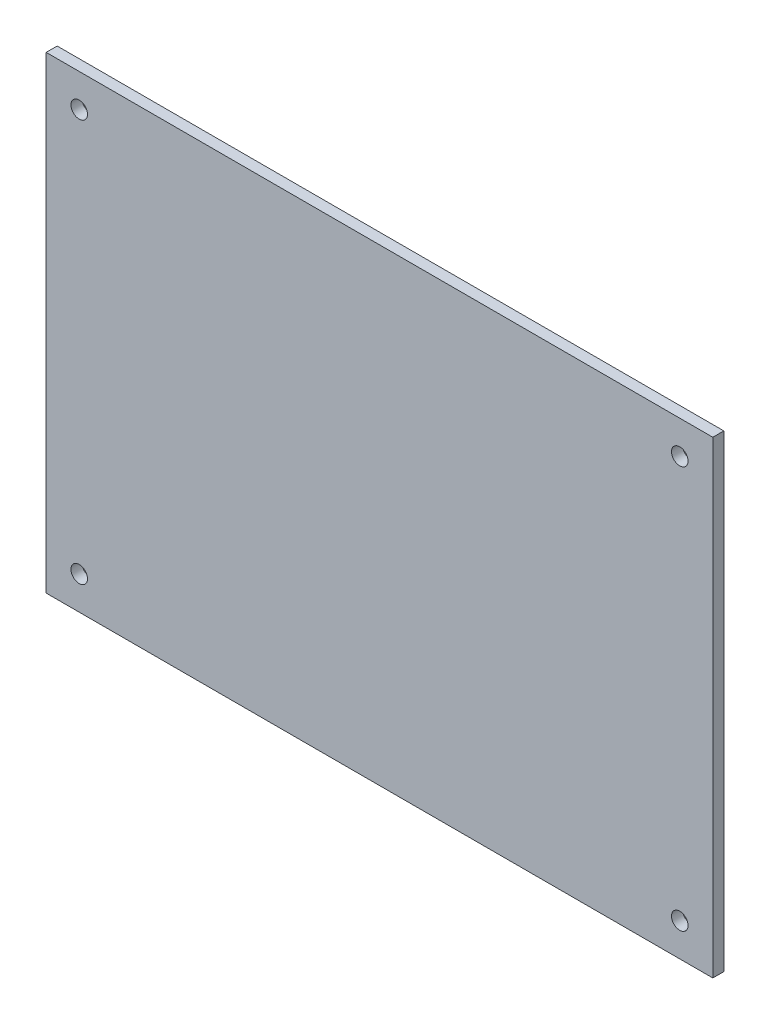
ISO-10303-21;
HEADER;
FILE_DESCRIPTION(('STEP AP214'),'2;1');
FILE_NAME('part.step','',(''),(''),'','','');
FILE_SCHEMA(('AUTOMOTIVE_DESIGN { 1 0 10303 214 1 1 1 1 }'));
ENDSEC;
DATA;
#1=APPLICATION_CONTEXT('core data for automotive mechanical design processes');
#2=APPLICATION_PROTOCOL_DEFINITION('international standard','automotive_design',2000,#1);
#3=PRODUCT_CONTEXT('',#1,'mechanical');
#4=PRODUCT('Part','Part','',(#3));
#5=PRODUCT_RELATED_PRODUCT_CATEGORY('part','',(#4));
#6=PRODUCT_DEFINITION_FORMATION('','',#4);
#7=PRODUCT_DEFINITION_CONTEXT('part definition',#1,'design');
#8=PRODUCT_DEFINITION('design','',#6,#7);
#9=PRODUCT_DEFINITION_SHAPE('','',#8);
#10=(LENGTH_UNIT() NAMED_UNIT(*) SI_UNIT(.MILLI.,.METRE.));
#11=(NAMED_UNIT(*) PLANE_ANGLE_UNIT() SI_UNIT($,.RADIAN.));
#12=(NAMED_UNIT(*) SI_UNIT($,.STERADIAN.) SOLID_ANGLE_UNIT());
#13=UNCERTAINTY_MEASURE_WITH_UNIT(LENGTH_MEASURE(1.E-05),#10,'distance_accuracy_value','');
#14=(GEOMETRIC_REPRESENTATION_CONTEXT(3) GLOBAL_UNCERTAINTY_ASSIGNED_CONTEXT((#13)) GLOBAL_UNIT_ASSIGNED_CONTEXT((#10,
#11,#12)) REPRESENTATION_CONTEXT('',''));
#15=CARTESIAN_POINT('',(0.,0.,0.));
#16=DIRECTION('',(0.,0.,1.));
#17=DIRECTION('',(1.,0.,0.));
#18=AXIS2_PLACEMENT_3D('',#15,#16,#17);
#19=CARTESIAN_POINT('',(0.,0.,2.));
#20=DIRECTION('',(1.,0.,0.));
#21=DIRECTION('',(0.,0.,-1.));
#22=AXIS2_PLACEMENT_3D('',#19,#20,#21);
#23=PLANE('',#22);
#24=DIRECTION('',(0.,-1.,0.));
#25=VECTOR('',#24,1.);
#26=CARTESIAN_POINT('',(0.,0.,0.));
#27=LINE('',#26,#25);
#28=CARTESIAN_POINT('',(0.,85.,0.));
#29=VERTEX_POINT('',#28);
#30=CARTESIAN_POINT('',(0.,0.,0.));
#31=VERTEX_POINT('',#30);
#32=EDGE_CURVE('E100',#29,#31,#27,.T.);
#33=ORIENTED_EDGE('',*,*,#32,.T.);
#34=DIRECTION('',(0.,0.,-1.));
#35=VECTOR('',#34,1.);
#36=CARTESIAN_POINT('',(0.,0.,2.));
#37=LINE('',#36,#35);
#38=CARTESIAN_POINT('',(0.,0.,2.));
#39=VERTEX_POINT('',#38);
#40=EDGE_CURVE('E11',#39,#31,#37,.T.);
#41=ORIENTED_EDGE('',*,*,#40,.F.);
#42=DIRECTION('',(0.,-1.,0.));
#43=VECTOR('',#42,1.);
#44=CARTESIAN_POINT('',(0.,0.,2.));
#45=LINE('',#44,#43);
#46=CARTESIAN_POINT('',(0.,85.,2.));
#47=VERTEX_POINT('',#46);
#48=EDGE_CURVE('E88',#47,#39,#45,.T.);
#49=ORIENTED_EDGE('',*,*,#48,.F.);
#50=DIRECTION('',(0.,0.,-1.));
#51=VECTOR('',#50,1.);
#52=CARTESIAN_POINT('',(0.,85.,2.));
#53=LINE('',#52,#51);
#54=EDGE_CURVE('E96',#47,#29,#53,.T.);
#55=ORIENTED_EDGE('',*,*,#54,.T.);
#56=EDGE_LOOP('',(#33,#41,#49,#55));
#57=FACE_BOUND('',#56,.T.);
#58=ADVANCED_FACE('F37',(#57),#23,.F.);
#59=CARTESIAN_POINT('',(0.,0.,2.));
#60=DIRECTION('',(0.,1.,0.));
#61=DIRECTION('',(0.,0.,1.));
#62=AXIS2_PLACEMENT_3D('',#59,#60,#61);
#63=PLANE('',#62);
#64=DIRECTION('',(1.,0.,0.));
#65=VECTOR('',#64,1.);
#66=CARTESIAN_POINT('',(0.,0.,0.));
#67=LINE('',#66,#65);
#68=CARTESIAN_POINT('',(121.,0.,0.));
#69=VERTEX_POINT('',#68);
#70=EDGE_CURVE('E92',#31,#69,#67,.T.);
#71=ORIENTED_EDGE('',*,*,#70,.T.);
#72=DIRECTION('',(0.,0.,-1.));
#73=VECTOR('',#72,1.);
#74=CARTESIAN_POINT('',(121.,0.,2.));
#75=LINE('',#74,#73);
#76=CARTESIAN_POINT('',(121.,0.,2.));
#77=VERTEX_POINT('',#76);
#78=EDGE_CURVE('E45',#77,#69,#75,.T.);
#79=ORIENTED_EDGE('',*,*,#78,.F.);
#80=DIRECTION('',(1.,0.,0.));
#81=VECTOR('',#80,1.);
#82=CARTESIAN_POINT('',(0.,0.,2.));
#83=LINE('',#82,#81);
#84=EDGE_CURVE('E83',#39,#77,#83,.T.);
#85=ORIENTED_EDGE('',*,*,#84,.F.);
#86=ORIENTED_EDGE('',*,*,#40,.T.);
#87=EDGE_LOOP('',(#71,#79,#85,#86));
#88=FACE_BOUND('',#87,.T.);
#89=ADVANCED_FACE('F91',(#88),#63,.F.);
#90=CARTESIAN_POINT('',(121.,0.,2.));
#91=DIRECTION('',(-1.,0.,0.));
#92=DIRECTION('',(0.,0.,1.));
#93=AXIS2_PLACEMENT_3D('',#90,#91,#92);
#94=PLANE('',#93);
#95=DIRECTION('',(0.,1.,0.));
#96=VECTOR('',#95,1.);
#97=CARTESIAN_POINT('',(121.,0.,0.));
#98=LINE('',#97,#96);
#99=CARTESIAN_POINT('',(121.,85.,0.));
#100=VERTEX_POINT('',#99);
#101=EDGE_CURVE('E70',#69,#100,#98,.T.);
#102=ORIENTED_EDGE('',*,*,#101,.T.);
#103=DIRECTION('',(0.,0.,-1.));
#104=VECTOR('',#103,1.);
#105=CARTESIAN_POINT('',(121.,85.,2.));
#106=LINE('',#105,#104);
#107=CARTESIAN_POINT('',(121.,85.,2.));
#108=VERTEX_POINT('',#107);
#109=EDGE_CURVE('E93',#108,#100,#106,.T.);
#110=ORIENTED_EDGE('',*,*,#109,.F.);
#111=DIRECTION('',(0.,1.,0.));
#112=VECTOR('',#111,1.);
#113=CARTESIAN_POINT('',(121.,0.,2.));
#114=LINE('',#113,#112);
#115=EDGE_CURVE('E86',#77,#108,#114,.T.);
#116=ORIENTED_EDGE('',*,*,#115,.F.);
#117=ORIENTED_EDGE('',*,*,#78,.T.);
#118=EDGE_LOOP('',(#102,#110,#116,#117));
#119=FACE_BOUND('',#118,.T.);
#120=ADVANCED_FACE('F94',(#119),#94,.F.);
#121=CARTESIAN_POINT('',(0.,85.,2.));
#122=DIRECTION('',(0.,-1.,0.));
#123=DIRECTION('',(0.,0.,-1.));
#124=AXIS2_PLACEMENT_3D('',#121,#122,#123);
#125=PLANE('',#124);
#126=DIRECTION('',(-1.,0.,0.));
#127=VECTOR('',#126,1.);
#128=CARTESIAN_POINT('',(0.,85.,0.));
#129=LINE('',#128,#127);
#130=EDGE_CURVE('E76',#100,#29,#129,.T.);
#131=ORIENTED_EDGE('',*,*,#130,.T.);
#132=ORIENTED_EDGE('',*,*,#54,.F.);
#133=DIRECTION('',(-1.,0.,0.));
#134=VECTOR('',#133,1.);
#135=CARTESIAN_POINT('',(0.,85.,2.));
#136=LINE('',#135,#134);
#137=EDGE_CURVE('E53',#108,#47,#136,.T.);
#138=ORIENTED_EDGE('',*,*,#137,.F.);
#139=ORIENTED_EDGE('',*,*,#109,.T.);
#140=EDGE_LOOP('',(#131,#132,#138,#139));
#141=FACE_BOUND('',#140,.T.);
#142=ADVANCED_FACE('F108',(#141),#125,.F.);
#143=CARTESIAN_POINT('',(0.,0.,2.));
#144=DIRECTION('',(0.,0.,-1.));
#145=DIRECTION('',(-1.,0.,0.));
#146=AXIS2_PLACEMENT_3D('',#143,#144,#145);
#147=PLANE('',#146);
#148=CARTESIAN_POINT('',(115.,79.,2.));
#149=DIRECTION('',(0.,0.,1.));
#150=DIRECTION('',(1.,0.,0.));
#151=AXIS2_PLACEMENT_3D('',#148,#149,#150);
#152=CIRCLE('',#151,1.5);
#153=CARTESIAN_POINT('',(116.5,79.,2.));
#154=VERTEX_POINT('',#153);
#155=EDGE_CURVE('E127',#154,#154,#152,.T.);
#156=ORIENTED_EDGE('',*,*,#155,.F.);
#157=EDGE_LOOP('',(#156));
#158=FACE_BOUND('',#157,.T.);
#159=CARTESIAN_POINT('',(6.,6.,2.));
#160=DIRECTION('',(0.,0.,1.));
#161=DIRECTION('',(1.,0.,0.));
#162=AXIS2_PLACEMENT_3D('',#159,#160,#161);
#163=CIRCLE('',#162,1.5);
#164=CARTESIAN_POINT('',(7.5,6.,2.));
#165=VERTEX_POINT('',#164);
#166=EDGE_CURVE('E120',#165,#165,#163,.T.);
#167=ORIENTED_EDGE('',*,*,#166,.F.);
#168=EDGE_LOOP('',(#167));
#169=FACE_BOUND('',#168,.T.);
#170=CARTESIAN_POINT('',(115.,6.,2.));
#171=DIRECTION('',(0.,0.,1.));
#172=DIRECTION('',(1.,0.,0.));
#173=AXIS2_PLACEMENT_3D('',#170,#171,#172);
#174=CIRCLE('',#173,1.5);
#175=CARTESIAN_POINT('',(116.5,6.,2.));
#176=VERTEX_POINT('',#175);
#177=EDGE_CURVE('E132',#176,#176,#174,.T.);
#178=ORIENTED_EDGE('',*,*,#177,.F.);
#179=EDGE_LOOP('',(#178));
#180=FACE_BOUND('',#179,.T.);
#181=CARTESIAN_POINT('',(6.,79.,2.));
#182=DIRECTION('',(0.,0.,1.));
#183=DIRECTION('',(1.,0.,0.));
#184=AXIS2_PLACEMENT_3D('',#181,#182,#183);
#185=CIRCLE('',#184,1.5);
#186=CARTESIAN_POINT('',(7.5,79.,2.));
#187=VERTEX_POINT('',#186);
#188=EDGE_CURVE('E114',#187,#187,#185,.T.);
#189=ORIENTED_EDGE('',*,*,#188,.F.);
#190=EDGE_LOOP('',(#189));
#191=FACE_BOUND('',#190,.T.);
#192=ORIENTED_EDGE('',*,*,#48,.T.);
#193=ORIENTED_EDGE('',*,*,#84,.T.);
#194=ORIENTED_EDGE('',*,*,#115,.T.);
#195=ORIENTED_EDGE('',*,*,#137,.T.);
#196=EDGE_LOOP('',(#192,#193,#194,#195));
#197=FACE_BOUND('',#196,.T.);
#198=ADVANCED_FACE('F84',(#158,#169,#180,#191,#197),#147,.F.);
#199=CARTESIAN_POINT('',(0.,0.,0.));
#200=DIRECTION('',(0.,0.,-1.));
#201=DIRECTION('',(-1.,0.,0.));
#202=AXIS2_PLACEMENT_3D('',#199,#200,#201);
#203=PLANE('',#202);
#204=CARTESIAN_POINT('',(115.,79.,0.));
#205=DIRECTION('',(0.,0.,1.));
#206=DIRECTION('',(1.,0.,0.));
#207=AXIS2_PLACEMENT_3D('',#204,#205,#206);
#208=CIRCLE('',#207,1.5);
#209=CARTESIAN_POINT('',(116.5,79.,0.));
#210=VERTEX_POINT('',#209);
#211=EDGE_CURVE('E117',#210,#210,#208,.T.);
#212=ORIENTED_EDGE('',*,*,#211,.T.);
#213=EDGE_LOOP('',(#212));
#214=FACE_BOUND('',#213,.T.);
#215=CARTESIAN_POINT('',(6.,6.,0.));
#216=DIRECTION('',(0.,0.,1.));
#217=DIRECTION('',(1.,0.,0.));
#218=AXIS2_PLACEMENT_3D('',#215,#216,#217);
#219=CIRCLE('',#218,1.5);
#220=CARTESIAN_POINT('',(7.5,6.,0.));
#221=VERTEX_POINT('',#220);
#222=EDGE_CURVE('E123',#221,#221,#219,.T.);
#223=ORIENTED_EDGE('',*,*,#222,.T.);
#224=EDGE_LOOP('',(#223));
#225=FACE_BOUND('',#224,.T.);
#226=CARTESIAN_POINT('',(115.,6.,0.));
#227=DIRECTION('',(0.,0.,1.));
#228=DIRECTION('',(1.,0.,0.));
#229=AXIS2_PLACEMENT_3D('',#226,#227,#228);
#230=CIRCLE('',#229,1.5);
#231=CARTESIAN_POINT('',(116.5,6.,0.));
#232=VERTEX_POINT('',#231);
#233=EDGE_CURVE('E124',#232,#232,#230,.T.);
#234=ORIENTED_EDGE('',*,*,#233,.T.);
#235=EDGE_LOOP('',(#234));
#236=FACE_BOUND('',#235,.T.);
#237=CARTESIAN_POINT('',(6.,79.,0.));
#238=DIRECTION('',(0.,0.,1.));
#239=DIRECTION('',(1.,0.,0.));
#240=AXIS2_PLACEMENT_3D('',#237,#238,#239);
#241=CIRCLE('',#240,1.5);
#242=CARTESIAN_POINT('',(7.5,79.,0.));
#243=VERTEX_POINT('',#242);
#244=EDGE_CURVE('E103',#243,#243,#241,.T.);
#245=ORIENTED_EDGE('',*,*,#244,.T.);
#246=EDGE_LOOP('',(#245));
#247=FACE_BOUND('',#246,.T.);
#248=ORIENTED_EDGE('',*,*,#32,.F.);
#249=ORIENTED_EDGE('',*,*,#130,.F.);
#250=ORIENTED_EDGE('',*,*,#101,.F.);
#251=ORIENTED_EDGE('',*,*,#70,.F.);
#252=EDGE_LOOP('',(#248,#249,#250,#251));
#253=FACE_BOUND('',#252,.T.);
#254=ADVANCED_FACE('F111',(#214,#225,#236,#247,#253),#203,.T.);
#255=CARTESIAN_POINT('',(6.,79.,0.));
#256=DIRECTION('',(0.,0.,1.));
#257=DIRECTION('',(1.,0.,0.));
#258=AXIS2_PLACEMENT_3D('',#255,#256,#257);
#259=CYLINDRICAL_SURFACE('',#258,1.5);
#260=ORIENTED_EDGE('',*,*,#244,.F.);
#261=EDGE_LOOP('',(#260));
#262=FACE_BOUND('',#261,.T.);
#263=ORIENTED_EDGE('',*,*,#188,.T.);
#264=EDGE_LOOP('',(#263));
#265=FACE_BOUND('',#264,.T.);
#266=ADVANCED_FACE('F144',(#262,#265),#259,.F.);
#267=CARTESIAN_POINT('',(115.,6.,0.));
#268=DIRECTION('',(0.,0.,1.));
#269=DIRECTION('',(1.,0.,0.));
#270=AXIS2_PLACEMENT_3D('',#267,#268,#269);
#271=CYLINDRICAL_SURFACE('',#270,1.5);
#272=ORIENTED_EDGE('',*,*,#233,.F.);
#273=EDGE_LOOP('',(#272));
#274=FACE_BOUND('',#273,.T.);
#275=ORIENTED_EDGE('',*,*,#177,.T.);
#276=EDGE_LOOP('',(#275));
#277=FACE_BOUND('',#276,.T.);
#278=ADVANCED_FACE('F140',(#274,#277),#271,.F.);
#279=CARTESIAN_POINT('',(6.,6.,0.));
#280=DIRECTION('',(0.,0.,1.));
#281=DIRECTION('',(1.,0.,0.));
#282=AXIS2_PLACEMENT_3D('',#279,#280,#281);
#283=CYLINDRICAL_SURFACE('',#282,1.5);
#284=ORIENTED_EDGE('',*,*,#222,.F.);
#285=EDGE_LOOP('',(#284));
#286=FACE_BOUND('',#285,.T.);
#287=ORIENTED_EDGE('',*,*,#166,.T.);
#288=EDGE_LOOP('',(#287));
#289=FACE_BOUND('',#288,.T.);
#290=ADVANCED_FACE('F143',(#286,#289),#283,.F.);
#291=CARTESIAN_POINT('',(115.,79.,0.));
#292=DIRECTION('',(0.,0.,1.));
#293=DIRECTION('',(1.,0.,0.));
#294=AXIS2_PLACEMENT_3D('',#291,#292,#293);
#295=CYLINDRICAL_SURFACE('',#294,1.5);
#296=ORIENTED_EDGE('',*,*,#211,.F.);
#297=EDGE_LOOP('',(#296));
#298=FACE_BOUND('',#297,.T.);
#299=ORIENTED_EDGE('',*,*,#155,.T.);
#300=EDGE_LOOP('',(#299));
#301=FACE_BOUND('',#300,.T.);
#302=ADVANCED_FACE('F205',(#298,#301),#295,.F.);
#303=CLOSED_SHELL('',(#58,#89,#120,#142,#198,#254,#266,#278,#290,#302));
#304=MANIFOLD_SOLID_BREP('B2',#303);
#305=ADVANCED_BREP_SHAPE_REPRESENTATION('',(#18,#304),#14);
#306=SHAPE_DEFINITION_REPRESENTATION(#9,#305);
ENDSEC;
END-ISO-10303-21;
